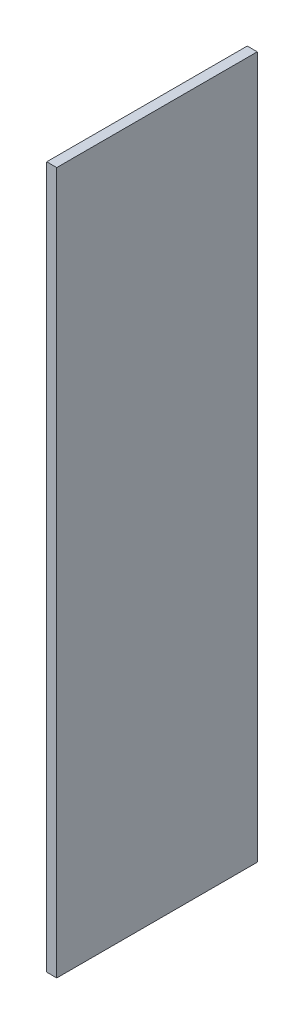
ISO-10303-21;
HEADER;
FILE_DESCRIPTION(('STEP AP214'),'2;1');
FILE_NAME('part.step','',(''),(''),'','','');
FILE_SCHEMA(('AUTOMOTIVE_DESIGN { 1 0 10303 214 1 1 1 1 }'));
ENDSEC;
DATA;
#1=APPLICATION_CONTEXT('core data for automotive mechanical design processes');
#2=APPLICATION_PROTOCOL_DEFINITION('international standard','automotive_design',2000,#1);
#3=PRODUCT_CONTEXT('',#1,'mechanical');
#4=PRODUCT('Part','Part','',(#3));
#5=PRODUCT_RELATED_PRODUCT_CATEGORY('part','',(#4));
#6=PRODUCT_DEFINITION_FORMATION('','',#4);
#7=PRODUCT_DEFINITION_CONTEXT('part definition',#1,'design');
#8=PRODUCT_DEFINITION('design','',#6,#7);
#9=PRODUCT_DEFINITION_SHAPE('','',#8);
#10=(LENGTH_UNIT() NAMED_UNIT(*) SI_UNIT(.MILLI.,.METRE.));
#11=(NAMED_UNIT(*) PLANE_ANGLE_UNIT() SI_UNIT($,.RADIAN.));
#12=(NAMED_UNIT(*) SI_UNIT($,.STERADIAN.) SOLID_ANGLE_UNIT());
#13=UNCERTAINTY_MEASURE_WITH_UNIT(LENGTH_MEASURE(1.E-05),#10,'distance_accuracy_value','');
#14=(GEOMETRIC_REPRESENTATION_CONTEXT(3) GLOBAL_UNCERTAINTY_ASSIGNED_CONTEXT((#13)) GLOBAL_UNIT_ASSIGNED_CONTEXT((#10,
#11,#12)) REPRESENTATION_CONTEXT('',''));
#15=CARTESIAN_POINT('',(0.,0.,0.));
#16=DIRECTION('',(0.,0.,1.));
#17=DIRECTION('',(1.,0.,0.));
#18=AXIS2_PLACEMENT_3D('',#15,#16,#17);
#19=CARTESIAN_POINT('',(0.,0.,200.));
#20=DIRECTION('',(1.,0.,0.));
#21=DIRECTION('',(0.,0.,-1.));
#22=AXIS2_PLACEMENT_3D('',#19,#20,#21);
#23=PLANE('',#22);
#24=DIRECTION('',(0.,-1.,0.));
#25=VECTOR('',#24,1.);
#26=CARTESIAN_POINT('',(0.,0.,0.));
#27=LINE('',#26,#25);
#28=CARTESIAN_POINT('',(0.,700.,0.));
#29=VERTEX_POINT('',#28);
#30=CARTESIAN_POINT('',(0.,0.,0.));
#31=VERTEX_POINT('',#30);
#32=EDGE_CURVE('E96',#29,#31,#27,.T.);
#33=ORIENTED_EDGE('',*,*,#32,.T.);
#34=DIRECTION('',(0.,0.,-1.));
#35=VECTOR('',#34,1.);
#36=CARTESIAN_POINT('',(0.,0.,200.));
#37=LINE('',#36,#35);
#38=CARTESIAN_POINT('',(0.,0.,200.));
#39=VERTEX_POINT('',#38);
#40=EDGE_CURVE('E11',#39,#31,#37,.T.);
#41=ORIENTED_EDGE('',*,*,#40,.F.);
#42=DIRECTION('',(0.,-1.,0.));
#43=VECTOR('',#42,1.);
#44=CARTESIAN_POINT('',(0.,0.,200.));
#45=LINE('',#44,#43);
#46=CARTESIAN_POINT('',(0.,700.,200.));
#47=VERTEX_POINT('',#46);
#48=EDGE_CURVE('E84',#47,#39,#45,.T.);
#49=ORIENTED_EDGE('',*,*,#48,.F.);
#50=DIRECTION('',(0.,0.,-1.));
#51=VECTOR('',#50,1.);
#52=CARTESIAN_POINT('',(0.,700.,200.));
#53=LINE('',#52,#51);
#54=EDGE_CURVE('E92',#47,#29,#53,.T.);
#55=ORIENTED_EDGE('',*,*,#54,.T.);
#56=EDGE_LOOP('',(#33,#41,#49,#55));
#57=FACE_BOUND('',#56,.T.);
#58=ADVANCED_FACE('F33',(#57),#23,.F.);
#59=CARTESIAN_POINT('',(0.,0.,200.));
#60=DIRECTION('',(0.,1.,0.));
#61=DIRECTION('',(0.,0.,1.));
#62=AXIS2_PLACEMENT_3D('',#59,#60,#61);
#63=PLANE('',#62);
#64=DIRECTION('',(1.,0.,0.));
#65=VECTOR('',#64,1.);
#66=CARTESIAN_POINT('',(0.,0.,0.));
#67=LINE('',#66,#65);
#68=CARTESIAN_POINT('',(10.,0.,0.));
#69=VERTEX_POINT('',#68);
#70=EDGE_CURVE('E88',#31,#69,#67,.T.);
#71=ORIENTED_EDGE('',*,*,#70,.T.);
#72=DIRECTION('',(0.,0.,-1.));
#73=VECTOR('',#72,1.);
#74=CARTESIAN_POINT('',(10.,0.,200.));
#75=LINE('',#74,#73);
#76=CARTESIAN_POINT('',(10.,0.,200.));
#77=VERTEX_POINT('',#76);
#78=EDGE_CURVE('E41',#77,#69,#75,.T.);
#79=ORIENTED_EDGE('',*,*,#78,.F.);
#80=DIRECTION('',(1.,0.,0.));
#81=VECTOR('',#80,1.);
#82=CARTESIAN_POINT('',(0.,0.,200.));
#83=LINE('',#82,#81);
#84=EDGE_CURVE('E79',#39,#77,#83,.T.);
#85=ORIENTED_EDGE('',*,*,#84,.F.);
#86=ORIENTED_EDGE('',*,*,#40,.T.);
#87=EDGE_LOOP('',(#71,#79,#85,#86));
#88=FACE_BOUND('',#87,.T.);
#89=ADVANCED_FACE('F87',(#88),#63,.F.);
#90=CARTESIAN_POINT('',(10.,0.,200.));
#91=DIRECTION('',(-1.,0.,0.));
#92=DIRECTION('',(0.,0.,1.));
#93=AXIS2_PLACEMENT_3D('',#90,#91,#92);
#94=PLANE('',#93);
#95=DIRECTION('',(0.,1.,0.));
#96=VECTOR('',#95,1.);
#97=CARTESIAN_POINT('',(10.,0.,0.));
#98=LINE('',#97,#96);
#99=CARTESIAN_POINT('',(10.,700.,0.));
#100=VERTEX_POINT('',#99);
#101=EDGE_CURVE('E66',#69,#100,#98,.T.);
#102=ORIENTED_EDGE('',*,*,#101,.T.);
#103=DIRECTION('',(0.,0.,-1.));
#104=VECTOR('',#103,1.);
#105=CARTESIAN_POINT('',(10.,700.,200.));
#106=LINE('',#105,#104);
#107=CARTESIAN_POINT('',(10.,700.,200.));
#108=VERTEX_POINT('',#107);
#109=EDGE_CURVE('E89',#108,#100,#106,.T.);
#110=ORIENTED_EDGE('',*,*,#109,.F.);
#111=DIRECTION('',(0.,1.,0.));
#112=VECTOR('',#111,1.);
#113=CARTESIAN_POINT('',(10.,0.,200.));
#114=LINE('',#113,#112);
#115=EDGE_CURVE('E82',#77,#108,#114,.T.);
#116=ORIENTED_EDGE('',*,*,#115,.F.);
#117=ORIENTED_EDGE('',*,*,#78,.T.);
#118=EDGE_LOOP('',(#102,#110,#116,#117));
#119=FACE_BOUND('',#118,.T.);
#120=ADVANCED_FACE('F90',(#119),#94,.F.);
#121=CARTESIAN_POINT('',(0.,700.,200.));
#122=DIRECTION('',(0.,-1.,0.));
#123=DIRECTION('',(0.,0.,-1.));
#124=AXIS2_PLACEMENT_3D('',#121,#122,#123);
#125=PLANE('',#124);
#126=DIRECTION('',(-1.,0.,0.));
#127=VECTOR('',#126,1.);
#128=CARTESIAN_POINT('',(0.,700.,0.));
#129=LINE('',#128,#127);
#130=EDGE_CURVE('E72',#100,#29,#129,.T.);
#131=ORIENTED_EDGE('',*,*,#130,.T.);
#132=ORIENTED_EDGE('',*,*,#54,.F.);
#133=DIRECTION('',(-1.,0.,0.));
#134=VECTOR('',#133,1.);
#135=CARTESIAN_POINT('',(0.,700.,200.));
#136=LINE('',#135,#134);
#137=EDGE_CURVE('E49',#108,#47,#136,.T.);
#138=ORIENTED_EDGE('',*,*,#137,.F.);
#139=ORIENTED_EDGE('',*,*,#109,.T.);
#140=EDGE_LOOP('',(#131,#132,#138,#139));
#141=FACE_BOUND('',#140,.T.);
#142=ADVANCED_FACE('F103',(#141),#125,.F.);
#143=CARTESIAN_POINT('',(0.,0.,200.));
#144=DIRECTION('',(0.,0.,-1.));
#145=DIRECTION('',(-1.,0.,0.));
#146=AXIS2_PLACEMENT_3D('',#143,#144,#145);
#147=PLANE('',#146);
#148=ORIENTED_EDGE('',*,*,#48,.T.);
#149=ORIENTED_EDGE('',*,*,#84,.T.);
#150=ORIENTED_EDGE('',*,*,#115,.T.);
#151=ORIENTED_EDGE('',*,*,#137,.T.);
#152=EDGE_LOOP('',(#148,#149,#150,#151));
#153=FACE_BOUND('',#152,.T.);
#154=ADVANCED_FACE('F80',(#153),#147,.F.);
#155=CARTESIAN_POINT('',(0.,0.,0.));
#156=DIRECTION('',(0.,0.,-1.));
#157=DIRECTION('',(-1.,0.,0.));
#158=AXIS2_PLACEMENT_3D('',#155,#156,#157);
#159=PLANE('',#158);
#160=ORIENTED_EDGE('',*,*,#32,.F.);
#161=ORIENTED_EDGE('',*,*,#130,.F.);
#162=ORIENTED_EDGE('',*,*,#101,.F.);
#163=ORIENTED_EDGE('',*,*,#70,.F.);
#164=EDGE_LOOP('',(#160,#161,#162,#163));
#165=FACE_BOUND('',#164,.T.);
#166=ADVANCED_FACE('F106',(#165),#159,.T.);
#167=CLOSED_SHELL('',(#58,#89,#120,#142,#154,#166));
#168=MANIFOLD_SOLID_BREP('B2',#167);
#169=ADVANCED_BREP_SHAPE_REPRESENTATION('',(#18,#168),#14);
#170=SHAPE_DEFINITION_REPRESENTATION(#9,#169);
ENDSEC;
END-ISO-10303-21;
